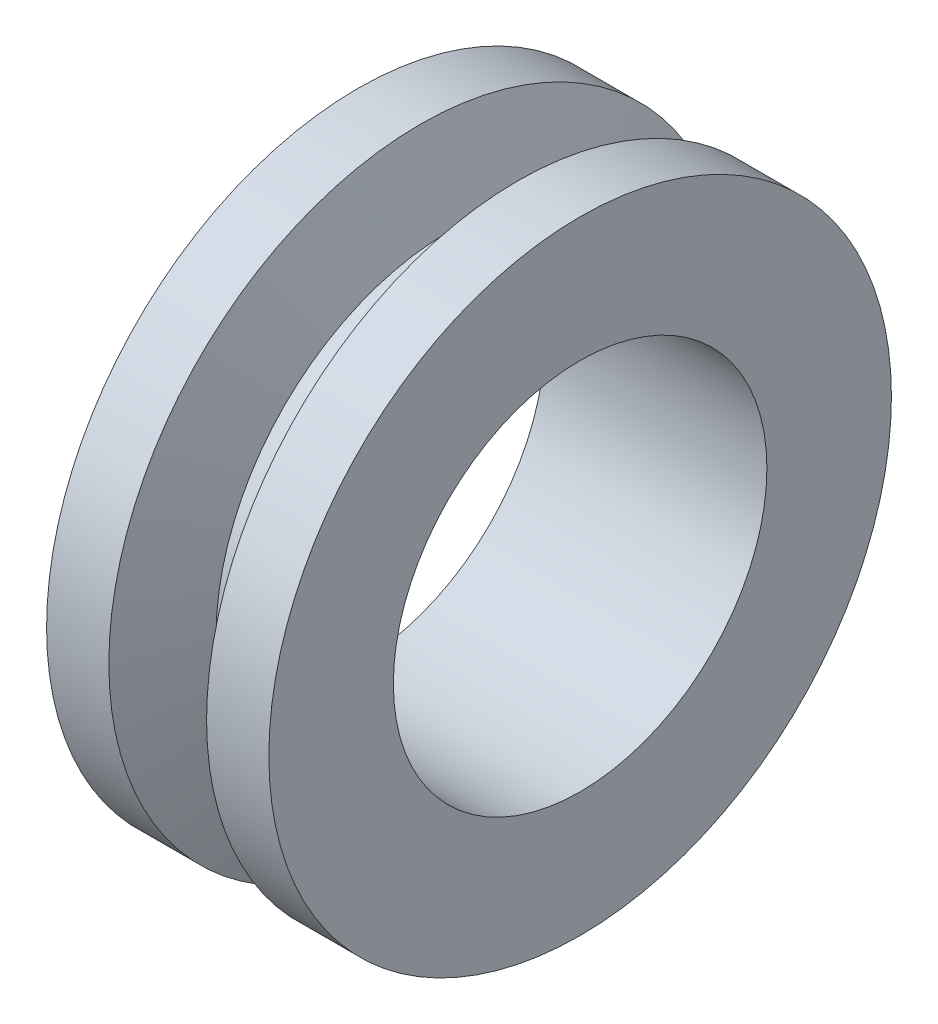
ISO-10303-21;
HEADER;
FILE_DESCRIPTION(('STEP AP214'),'2;1');
FILE_NAME('part.step','',(''),(''),'','','');
FILE_SCHEMA(('AUTOMOTIVE_DESIGN { 1 0 10303 214 1 1 1 1 }'));
ENDSEC;
DATA;
#1=APPLICATION_CONTEXT('core data for automotive mechanical design processes');
#2=APPLICATION_PROTOCOL_DEFINITION('international standard','automotive_design',2000,#1);
#3=PRODUCT_CONTEXT('',#1,'mechanical');
#4=PRODUCT('Part','Part','',(#3));
#5=PRODUCT_RELATED_PRODUCT_CATEGORY('part','',(#4));
#6=PRODUCT_DEFINITION_FORMATION('','',#4);
#7=PRODUCT_DEFINITION_CONTEXT('part definition',#1,'design');
#8=PRODUCT_DEFINITION('design','',#6,#7);
#9=PRODUCT_DEFINITION_SHAPE('','',#8);
#10=(LENGTH_UNIT() NAMED_UNIT(*) SI_UNIT(.MILLI.,.METRE.));
#11=(NAMED_UNIT(*) PLANE_ANGLE_UNIT() SI_UNIT($,.RADIAN.));
#12=(NAMED_UNIT(*) SI_UNIT($,.STERADIAN.) SOLID_ANGLE_UNIT());
#13=UNCERTAINTY_MEASURE_WITH_UNIT(LENGTH_MEASURE(1.E-05),#10,'distance_accuracy_value','');
#14=(GEOMETRIC_REPRESENTATION_CONTEXT(3) GLOBAL_UNCERTAINTY_ASSIGNED_CONTEXT((#13)) GLOBAL_UNIT_ASSIGNED_CONTEXT((#10,
#11,#12)) REPRESENTATION_CONTEXT('',''));
#15=CARTESIAN_POINT('',(0.,0.,0.));
#16=DIRECTION('',(0.,0.,1.));
#17=DIRECTION('',(1.,0.,0.));
#18=AXIS2_PLACEMENT_3D('',#15,#16,#17);
#19=CARTESIAN_POINT('',(27.1637305699479,40.,0.));
#20=DIRECTION('',(1.,0.,0.));
#21=DIRECTION('',(0.,1.,0.));
#22=AXIS2_PLACEMENT_3D('',#19,#20,#21);
#23=PLANE('',#22);
#24=CARTESIAN_POINT('',(27.1637305699478,0.,0.));
#25=DIRECTION('',(1.,0.,0.));
#26=DIRECTION('',(0.,1.,0.));
#27=AXIS2_PLACEMENT_3D('',#24,#25,#26);
#28=CIRCLE('',#27,40.);
#29=CARTESIAN_POINT('',(27.1637305699478,40.,0.));
#30=VERTEX_POINT('',#29);
#31=EDGE_CURVE('E61',#30,#30,#28,.T.);
#32=ORIENTED_EDGE('',*,*,#31,.T.);
#33=EDGE_LOOP('',(#32));
#34=FACE_BOUND('',#33,.T.);
#35=CARTESIAN_POINT('',(27.1637305699479,0.,0.));
#36=DIRECTION('',(1.,0.,0.));
#37=DIRECTION('',(0.,1.,0.));
#38=AXIS2_PLACEMENT_3D('',#35,#36,#37);
#39=CIRCLE('',#38,24.);
#40=CARTESIAN_POINT('',(27.1637305699479,24.,0.));
#41=VERTEX_POINT('',#40);
#42=EDGE_CURVE('E10',#41,#41,#39,.T.);
#43=ORIENTED_EDGE('',*,*,#42,.F.);
#44=EDGE_LOOP('',(#43));
#45=FACE_BOUND('',#44,.T.);
#46=ADVANCED_FACE('F33',(#34,#45),#23,.T.);
#47=CARTESIAN_POINT('',(0.,0.,0.));
#48=DIRECTION('',(1.,0.,0.));
#49=DIRECTION('',(0.,1.,0.));
#50=AXIS2_PLACEMENT_3D('',#47,#48,#49);
#51=CYLINDRICAL_SURFACE('',#50,24.);
#52=ORIENTED_EDGE('',*,*,#42,.T.);
#53=EDGE_LOOP('',(#52));
#54=FACE_BOUND('',#53,.T.);
#55=CARTESIAN_POINT('',(-1.39689119170998,0.,0.));
#56=DIRECTION('',(1.,0.,0.));
#57=DIRECTION('',(0.,1.,0.));
#58=AXIS2_PLACEMENT_3D('',#55,#56,#57);
#59=CIRCLE('',#58,24.);
#60=CARTESIAN_POINT('',(-1.39689119170998,24.,0.));
#61=VERTEX_POINT('',#60);
#62=EDGE_CURVE('E39',#61,#61,#59,.T.);
#63=ORIENTED_EDGE('',*,*,#62,.F.);
#64=EDGE_LOOP('',(#63));
#65=FACE_BOUND('',#64,.T.);
#66=ADVANCED_FACE('F79',(#54,#65),#51,.F.);
#67=CARTESIAN_POINT('',(-1.39689119170997,24.,0.));
#68=DIRECTION('',(-1.,0.,0.));
#69=DIRECTION('',(0.,-1.,0.));
#70=AXIS2_PLACEMENT_3D('',#67,#68,#69);
#71=PLANE('',#70);
#72=ORIENTED_EDGE('',*,*,#62,.T.);
#73=EDGE_LOOP('',(#72));
#74=FACE_BOUND('',#73,.T.);
#75=CARTESIAN_POINT('',(-1.39689119170997,0.,0.));
#76=DIRECTION('',(1.,0.,0.));
#77=DIRECTION('',(0.,1.,0.));
#78=AXIS2_PLACEMENT_3D('',#75,#76,#77);
#79=CIRCLE('',#78,40.);
#80=CARTESIAN_POINT('',(-1.39689119170997,40.,0.));
#81=VERTEX_POINT('',#80);
#82=EDGE_CURVE('E43',#81,#81,#79,.T.);
#83=ORIENTED_EDGE('',*,*,#82,.F.);
#84=EDGE_LOOP('',(#83));
#85=FACE_BOUND('',#84,.T.);
#86=ADVANCED_FACE('F83',(#74,#85),#71,.T.);
#87=CARTESIAN_POINT('',(0.,0.,0.));
#88=DIRECTION('',(1.,0.,0.));
#89=DIRECTION('',(0.,1.,0.));
#90=AXIS2_PLACEMENT_3D('',#87,#88,#89);
#91=CYLINDRICAL_SURFACE('',#90,40.);
#92=ORIENTED_EDGE('',*,*,#82,.T.);
#93=EDGE_LOOP('',(#92));
#94=FACE_BOUND('',#93,.T.);
#95=CARTESIAN_POINT('',(6.60310880829003,0.,0.));
#96=DIRECTION('',(1.,0.,0.));
#97=DIRECTION('',(0.,1.,0.));
#98=AXIS2_PLACEMENT_3D('',#95,#96,#97);
#99=CIRCLE('',#98,40.);
#100=CARTESIAN_POINT('',(6.60310880829003,40.,0.));
#101=VERTEX_POINT('',#100);
#102=EDGE_CURVE('E47',#101,#101,#99,.T.);
#103=ORIENTED_EDGE('',*,*,#102,.F.);
#104=EDGE_LOOP('',(#103));
#105=FACE_BOUND('',#104,.T.);
#106=ADVANCED_FACE('F87',(#94,#105),#91,.T.);
#107=CARTESIAN_POINT('',(10.3834196891189,0.,0.));
#108=DIRECTION('',(-1.,0.,0.));
#109=DIRECTION('',(0.,-1.,0.));
#110=AXIS2_PLACEMENT_3D('',#107,#108,#109);
#111=CONICAL_SURFACE('',#110,30.,1.20937091598291);
#112=ORIENTED_EDGE('',*,*,#102,.T.);
#113=EDGE_LOOP('',(#112));
#114=FACE_BOUND('',#113,.T.);
#115=CARTESIAN_POINT('',(10.3834196891189,0.,0.));
#116=DIRECTION('',(1.,0.,0.));
#117=DIRECTION('',(0.,1.,0.));
#118=AXIS2_PLACEMENT_3D('',#115,#116,#117);
#119=CIRCLE('',#118,30.);
#120=CARTESIAN_POINT('',(10.3834196891189,30.,0.));
#121=VERTEX_POINT('',#120);
#122=EDGE_CURVE('E52',#121,#121,#119,.T.);
#123=ORIENTED_EDGE('',*,*,#122,.F.);
#124=EDGE_LOOP('',(#123));
#125=FACE_BOUND('',#124,.T.);
#126=ADVANCED_FACE('F93',(#114,#125),#111,.T.);
#127=CARTESIAN_POINT('',(0.,0.,0.));
#128=DIRECTION('',(1.,0.,0.));
#129=DIRECTION('',(0.,1.,0.));
#130=AXIS2_PLACEMENT_3D('',#127,#128,#129);
#131=CYLINDRICAL_SURFACE('',#130,30.);
#132=ORIENTED_EDGE('',*,*,#122,.T.);
#133=EDGE_LOOP('',(#132));
#134=FACE_BOUND('',#133,.T.);
#135=CARTESIAN_POINT('',(15.3834196891189,0.,0.));
#136=DIRECTION('',(1.,0.,0.));
#137=DIRECTION('',(0.,1.,0.));
#138=AXIS2_PLACEMENT_3D('',#135,#136,#137);
#139=CIRCLE('',#138,30.);
#140=CARTESIAN_POINT('',(15.3834196891189,30.,0.));
#141=VERTEX_POINT('',#140);
#142=EDGE_CURVE('E55',#141,#141,#139,.T.);
#143=ORIENTED_EDGE('',*,*,#142,.F.);
#144=EDGE_LOOP('',(#143));
#145=FACE_BOUND('',#144,.T.);
#146=ADVANCED_FACE('F75',(#134,#145),#131,.T.);
#147=CARTESIAN_POINT('',(19.1637305699478,0.,0.));
#148=DIRECTION('',(1.,0.,0.));
#149=DIRECTION('',(0.,1.,0.));
#150=AXIS2_PLACEMENT_3D('',#147,#148,#149);
#151=CONICAL_SURFACE('',#150,40.,1.20937091598291);
#152=ORIENTED_EDGE('',*,*,#142,.T.);
#153=EDGE_LOOP('',(#152));
#154=FACE_BOUND('',#153,.T.);
#155=CARTESIAN_POINT('',(19.1637305699478,0.,0.));
#156=DIRECTION('',(1.,0.,0.));
#157=DIRECTION('',(0.,1.,0.));
#158=AXIS2_PLACEMENT_3D('',#155,#156,#157);
#159=CIRCLE('',#158,40.);
#160=CARTESIAN_POINT('',(19.1637305699478,40.,0.));
#161=VERTEX_POINT('',#160);
#162=EDGE_CURVE('E58',#161,#161,#159,.T.);
#163=ORIENTED_EDGE('',*,*,#162,.F.);
#164=EDGE_LOOP('',(#163));
#165=FACE_BOUND('',#164,.T.);
#166=ADVANCED_FACE('F69',(#154,#165),#151,.T.);
#167=CARTESIAN_POINT('',(0.,0.,0.));
#168=DIRECTION('',(1.,0.,0.));
#169=DIRECTION('',(0.,1.,0.));
#170=AXIS2_PLACEMENT_3D('',#167,#168,#169);
#171=CYLINDRICAL_SURFACE('',#170,40.);
#172=ORIENTED_EDGE('',*,*,#162,.T.);
#173=EDGE_LOOP('',(#172));
#174=FACE_BOUND('',#173,.T.);
#175=ORIENTED_EDGE('',*,*,#31,.F.);
#176=EDGE_LOOP('',(#175));
#177=FACE_BOUND('',#176,.T.);
#178=ADVANCED_FACE('F67',(#174,#177),#171,.T.);
#179=CLOSED_SHELL('',(#46,#66,#86,#106,#126,#146,#166,#178));
#180=MANIFOLD_SOLID_BREP('B2',#179);
#181=ADVANCED_BREP_SHAPE_REPRESENTATION('',(#18,#180),#14);
#182=SHAPE_DEFINITION_REPRESENTATION(#9,#181);
ENDSEC;
END-ISO-10303-21;
